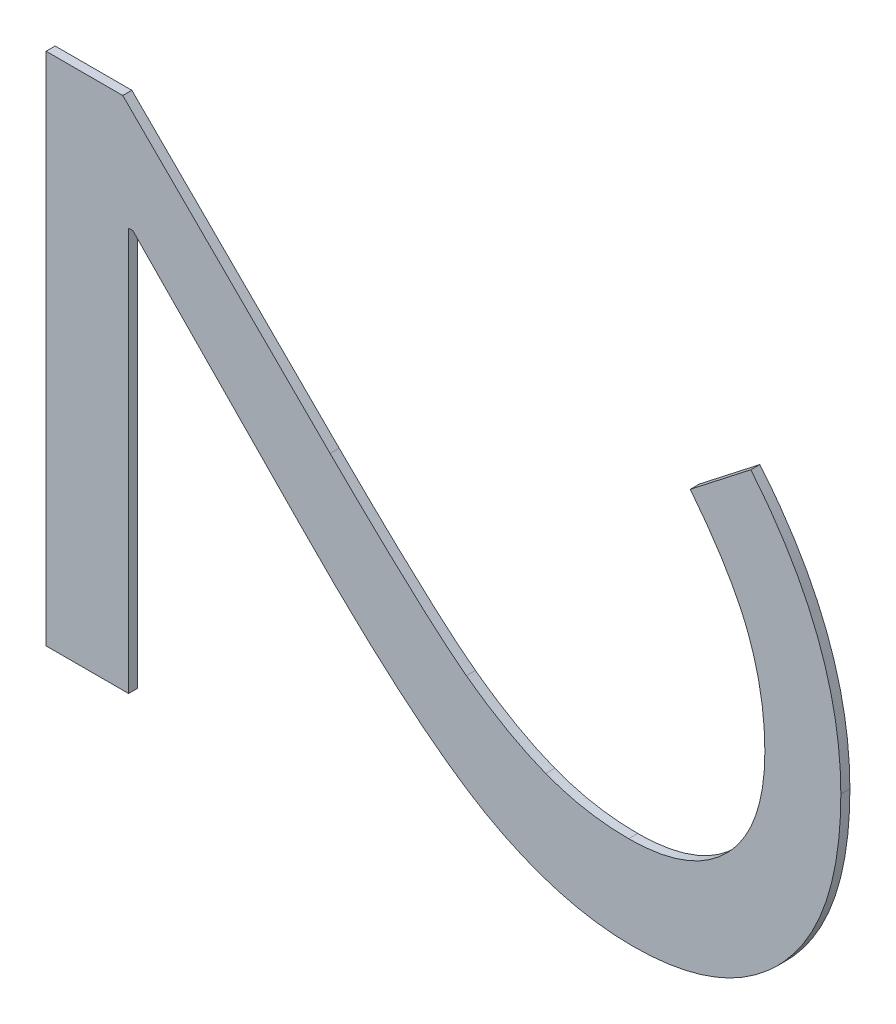
ISO-10303-21;
HEADER;
FILE_DESCRIPTION(('STEP AP214'),'2;1');
FILE_NAME('part.step','',(''),(''),'','','');
FILE_SCHEMA(('AUTOMOTIVE_DESIGN { 1 0 10303 214 1 1 1 1 }'));
ENDSEC;
DATA;
#1=APPLICATION_CONTEXT('core data for automotive mechanical design processes');
#2=APPLICATION_PROTOCOL_DEFINITION('international standard','automotive_design',2000,#1);
#3=PRODUCT_CONTEXT('',#1,'mechanical');
#4=PRODUCT('Part','Part','',(#3));
#5=PRODUCT_RELATED_PRODUCT_CATEGORY('part','',(#4));
#6=PRODUCT_DEFINITION_FORMATION('','',#4);
#7=PRODUCT_DEFINITION_CONTEXT('part definition',#1,'design');
#8=PRODUCT_DEFINITION('design','',#6,#7);
#9=PRODUCT_DEFINITION_SHAPE('','',#8);
#10=(LENGTH_UNIT() NAMED_UNIT(*) SI_UNIT(.MILLI.,.METRE.));
#11=(NAMED_UNIT(*) PLANE_ANGLE_UNIT() SI_UNIT($,.RADIAN.));
#12=(NAMED_UNIT(*) SI_UNIT($,.STERADIAN.) SOLID_ANGLE_UNIT());
#13=UNCERTAINTY_MEASURE_WITH_UNIT(LENGTH_MEASURE(1.E-05),#10,'distance_accuracy_value','');
#14=(GEOMETRIC_REPRESENTATION_CONTEXT(3) GLOBAL_UNCERTAINTY_ASSIGNED_CONTEXT((#13)) GLOBAL_UNIT_ASSIGNED_CONTEXT((#10,
#11,#12)) REPRESENTATION_CONTEXT('',''));
#15=CARTESIAN_POINT('',(0.,0.,0.));
#16=DIRECTION('',(0.,0.,1.));
#17=DIRECTION('',(1.,0.,0.));
#18=AXIS2_PLACEMENT_3D('',#15,#16,#17);
#19=CARTESIAN_POINT('',(32.574920494297,13.734089114766,2.65));
#20=DIRECTION('',(0.,0.,1.));
#21=DIRECTION('',(1.,0.,0.));
#22=AXIS2_PLACEMENT_3D('',#19,#20,#21);
#23=PLANE('',#22);
#24=DIRECTION('',(0.708863560070966,-0.705345626769966,0.));
#25=VECTOR('',#24,1.);
#26=CARTESIAN_POINT('',(33.807483447109,15.013040133365,2.65));
#27=LINE('',#26,#25);
#28=CARTESIAN_POINT('',(33.921845873336,14.8992452626031,2.65));
#29=VERTEX_POINT('',#28);
#30=CARTESIAN_POINT('',(33.693121020883,15.126835004126,2.65));
#31=VERTEX_POINT('',#30);
#32=EDGE_CURVE('E316',#29,#31,#27,.F.);
#33=ORIENTED_EDGE('',*,*,#32,.T.);
#34=DIRECTION('',(1.,0.,0.));
#35=VECTOR('',#34,1.);
#36=CARTESIAN_POINT('',(33.65083813873,15.126835004126,2.65));
#37=LINE('',#36,#35);
#38=CARTESIAN_POINT('',(33.608555256577,15.126835004126,2.65));
#39=VERTEX_POINT('',#38);
#40=EDGE_CURVE('E323',#31,#39,#37,.F.);
#41=ORIENTED_EDGE('',*,*,#40,.T.);
#42=DIRECTION('',(0.,1.,0.));
#43=VECTOR('',#42,1.);
#44=CARTESIAN_POINT('',(33.608555256577,14.842773493822,2.65));
#45=LINE('',#44,#43);
#46=CARTESIAN_POINT('',(33.608555256577,14.558711983517,2.65));
#47=VERTEX_POINT('',#46);
#48=EDGE_CURVE('E313',#39,#47,#45,.F.);
#49=ORIENTED_EDGE('',*,*,#48,.T.);
#50=DIRECTION('',(1.,0.,0.));
#51=VECTOR('',#50,1.);
#52=CARTESIAN_POINT('',(33.654054286366,14.558711983517,2.65));
#53=LINE('',#52,#51);
#54=CARTESIAN_POINT('',(33.699553316155,14.558711983517,2.65));
#55=VERTEX_POINT('',#54);
#56=EDGE_CURVE('E543',#47,#55,#53,.T.);
#57=ORIENTED_EDGE('',*,*,#56,.T.);
#58=DIRECTION('',(0.,1.,0.));
#59=VECTOR('',#58,1.);
#60=CARTESIAN_POINT('',(33.699553316155,14.781004540698,2.65));
#61=LINE('',#60,#59);
#62=CARTESIAN_POINT('',(33.699553316155,15.00329709788,2.65));
#63=VERTEX_POINT('',#62);
#64=EDGE_CURVE('E572',#55,#63,#61,.T.);
#65=ORIENTED_EDGE('',*,*,#64,.T.);
#66=DIRECTION('',(1.,0.,0.));
#67=VECTOR('',#66,1.);
#68=CARTESIAN_POINT('',(33.701918130593,15.00329709788,2.65));
#69=LINE('',#68,#67);
#70=CARTESIAN_POINT('',(33.7042829450308,15.0032970978798,2.65));
#71=VERTEX_POINT('',#70);
#72=EDGE_CURVE('E568',#63,#71,#69,.T.);
#73=ORIENTED_EDGE('',*,*,#72,.T.);
#74=DIRECTION('',(-0.699198848635592,0.714927248093583,0.));
#75=VECTOR('',#74,1.);
#76=CARTESIAN_POINT('',(33.796794485849,14.908704520356,2.65));
#77=LINE('',#76,#75);
#78=CARTESIAN_POINT('',(33.8893060266679,14.8141119428319,2.65));
#79=VERTEX_POINT('',#78);
#80=EDGE_CURVE('E152',#71,#79,#77,.F.);
#81=ORIENTED_EDGE('',*,*,#80,.T.);
#82=CARTESIAN_POINT('',(33.889306026668,14.814111942832,2.65));
#83=CARTESIAN_POINT('',(34.012276377449,14.68773625926,2.65));
#84=CARTESIAN_POINT('',(34.092680068344,14.641575081428,2.65));
#85=B_SPLINE_CURVE_WITH_KNOTS('',2,(#82,#83,#84),.UNSPECIFIED.,.F.,.F.,(3,3),(0.,1.),.UNSPECIFIED.);
#86=CARTESIAN_POINT('',(34.092680068344,14.641575081428,2.65));
#87=VERTEX_POINT('',#86);
#88=EDGE_CURVE('E154',#79,#87,#85,.T.);
#89=ORIENTED_EDGE('',*,*,#88,.T.);
#90=CARTESIAN_POINT('',(34.092680068344,14.641575081428,2.65));
#91=CARTESIAN_POINT('',(34.17308375924,14.595413903596,2.65));
#92=CARTESIAN_POINT('',(34.255379301685,14.595413903596,2.65));
#93=B_SPLINE_CURVE_WITH_KNOTS('',2,(#90,#91,#92),.UNSPECIFIED.,.F.,.F.,(3,3),(0.,1.),.UNSPECIFIED.);
#94=CARTESIAN_POINT('',(34.255379301685,14.595413903596,2.65));
#95=VERTEX_POINT('',#94);
#96=EDGE_CURVE('E156',#87,#95,#93,.T.);
#97=ORIENTED_EDGE('',*,*,#96,.T.);
#98=CARTESIAN_POINT('',(34.255379301685,14.595413903596,2.65));
#99=CARTESIAN_POINT('',(34.360566247892,14.595413903596,2.65));
#100=CARTESIAN_POINT('',(34.42290275648,14.664561077766,2.65));
#101=B_SPLINE_CURVE_WITH_KNOTS('',2,(#98,#99,#100),.UNSPECIFIED.,.F.,.F.,(3,3),(0.,1.),.UNSPECIFIED.);
#102=CARTESIAN_POINT('',(34.42290275648,14.664561077766,2.65));
#103=VERTEX_POINT('',#102);
#104=EDGE_CURVE('E457',#95,#103,#101,.T.);
#105=ORIENTED_EDGE('',*,*,#104,.T.);
#106=CARTESIAN_POINT('',(34.42290275648,14.664561077766,2.65));
#107=CARTESIAN_POINT('',(34.485239265069,14.733708251936,2.65));
#108=CARTESIAN_POINT('',(34.485239265069,14.855543491787,2.65));
#109=B_SPLINE_CURVE_WITH_KNOTS('',2,(#106,#107,#108),.UNSPECIFIED.,.F.,.F.,(3,3),(0.,1.),.UNSPECIFIED.);
#110=CARTESIAN_POINT('',(34.485239265069,14.855543491787,2.65));
#111=VERTEX_POINT('',#110);
#112=EDGE_CURVE('E446',#103,#111,#109,.T.);
#113=ORIENTED_EDGE('',*,*,#112,.T.);
#114=CARTESIAN_POINT('',(34.485239265069,14.855543491787,2.65));
#115=CARTESIAN_POINT('',(34.485239265069,14.996297247143,2.65));
#116=CARTESIAN_POINT('',(34.385917058668,15.115673079978,2.65));
#117=B_SPLINE_CURVE_WITH_KNOTS('',2,(#114,#115,#116),.UNSPECIFIED.,.F.,.F.,(3,3),(0.,1.),.UNSPECIFIED.);
#118=CARTESIAN_POINT('',(34.385917058668,15.115673079978,2.65));
#119=VERTEX_POINT('',#118);
#120=EDGE_CURVE('E445',#111,#119,#117,.T.);
#121=ORIENTED_EDGE('',*,*,#120,.T.);
#122=DIRECTION('',(0.788870641638834,0.614559281729871,0.));
#123=VECTOR('',#122,1.);
#124=CARTESIAN_POINT('',(34.352525878802,15.089660121159,2.65));
#125=LINE('',#124,#123);
#126=CARTESIAN_POINT('',(34.319134698936,15.06364716234,2.65));
#127=VERTEX_POINT('',#126);
#128=EDGE_CURVE('E486',#119,#127,#125,.F.);
#129=ORIENTED_EDGE('',*,*,#128,.T.);
#130=CARTESIAN_POINT('',(34.319134698936,15.06364716234,2.65));
#131=CARTESIAN_POINT('',(34.365863432233,15.004621393965,2.65));
#132=CARTESIAN_POINT('',(34.383646836808,14.956379179428,2.65));
#133=B_SPLINE_CURVE_WITH_KNOTS('',2,(#130,#131,#132),.UNSPECIFIED.,.F.,.F.,(3,3),(0.,1.),.UNSPECIFIED.);
#134=CARTESIAN_POINT('',(34.383646836808,14.956379179428,2.65));
#135=VERTEX_POINT('',#134);
#136=EDGE_CURVE('E410',#127,#135,#133,.T.);
#137=ORIENTED_EDGE('',*,*,#136,.T.);
#138=CARTESIAN_POINT('',(34.383646836808,14.956379179428,2.65));
#139=CARTESIAN_POINT('',(34.401430241382,14.908136964891,2.65));
#140=CARTESIAN_POINT('',(34.401430241382,14.854408380857,2.65));
#141=B_SPLINE_CURVE_WITH_KNOTS('',2,(#138,#139,#140),.UNSPECIFIED.,.F.,.F.,(3,3),(0.,1.),.UNSPECIFIED.);
#142=CARTESIAN_POINT('',(34.401430241382,14.854408380857,2.65));
#143=VERTEX_POINT('',#142);
#144=EDGE_CURVE('E399',#135,#143,#141,.T.);
#145=ORIENTED_EDGE('',*,*,#144,.T.);
#146=CARTESIAN_POINT('',(34.401430241382,14.854408380857,2.65));
#147=CARTESIAN_POINT('',(34.401430241382,14.779869429768,2.65));
#148=CARTESIAN_POINT('',(34.360944618202,14.737870325347,2.65));
#149=B_SPLINE_CURVE_WITH_KNOTS('',2,(#146,#147,#148),.UNSPECIFIED.,.F.,.F.,(3,3),(0.,1.),.UNSPECIFIED.);
#150=CARTESIAN_POINT('',(34.360944618202,14.737870325347,2.65));
#151=VERTEX_POINT('',#150);
#152=EDGE_CURVE('E398',#143,#151,#149,.T.);
#153=ORIENTED_EDGE('',*,*,#152,.T.);
#154=CARTESIAN_POINT('',(34.360944618202,14.737870325347,2.65));
#155=CARTESIAN_POINT('',(34.320458995022,14.695871220927,2.65));
#156=CARTESIAN_POINT('',(34.251217228274,14.695871220927,2.65));
#157=B_SPLINE_CURVE_WITH_KNOTS('',2,(#154,#155,#156),.UNSPECIFIED.,.F.,.F.,(3,3),(0.,1.),.UNSPECIFIED.);
#158=CARTESIAN_POINT('',(34.251217228274,14.695871220927,2.65));
#159=VERTEX_POINT('',#158);
#160=EDGE_CURVE('E368',#151,#159,#157,.T.);
#161=ORIENTED_EDGE('',*,*,#160,.T.);
#162=CARTESIAN_POINT('',(34.251217228274,14.695871220927,2.65));
#163=CARTESIAN_POINT('',(34.202218273117,14.695871220927,2.65));
#164=CARTESIAN_POINT('',(34.159651613231,14.712424921993,2.65));
#165=B_SPLINE_CURVE_WITH_KNOTS('',2,(#162,#163,#164),.UNSPECIFIED.,.F.,.F.,(3,3),(0.,1.),.UNSPECIFIED.);
#166=CARTESIAN_POINT('',(34.159651613231,14.712424921993,2.65));
#167=VERTEX_POINT('',#166);
#168=EDGE_CURVE('E357',#159,#167,#165,.T.);
#169=ORIENTED_EDGE('',*,*,#168,.T.);
#170=CARTESIAN_POINT('',(34.159651613231,14.712424921993,2.65));
#171=CARTESIAN_POINT('',(34.117084953345,14.72897862306,2.65));
#172=CARTESIAN_POINT('',(34.072153479021,14.762086025194,2.65));
#173=B_SPLINE_CURVE_WITH_KNOTS('',2,(#170,#171,#172),.UNSPECIFIED.,.F.,.F.,(3,3),(0.,1.),.UNSPECIFIED.);
#174=CARTESIAN_POINT('',(34.072153479021,14.762086025194,2.65));
#175=VERTEX_POINT('',#174);
#176=EDGE_CURVE('E356',#167,#175,#173,.T.);
#177=ORIENTED_EDGE('',*,*,#176,.T.);
#178=CARTESIAN_POINT('',(34.072153479021,14.762086025194,2.65));
#179=CARTESIAN_POINT('',(34.027222004698,14.795193427327,2.65));
#180=CARTESIAN_POINT('',(33.921845873336,14.899245262603,2.65));
#181=B_SPLINE_CURVE_WITH_KNOTS('',2,(#178,#179,#180),.UNSPECIFIED.,.F.,.F.,(3,3),(0.,1.),.UNSPECIFIED.);
#182=EDGE_CURVE('E317',#175,#29,#181,.T.);
#183=ORIENTED_EDGE('',*,*,#182,.T.);
#184=EDGE_LOOP('',(#33,#41,#49,#57,#65,#73,#81,#89,#97,#105,#113,#121,#129,#137,#145,#153,#161,
#169,#177,#183));
#185=FACE_BOUND('',#184,.T.);
#186=ADVANCED_FACE('F17',(#185),#23,.T.);
#187=CARTESIAN_POINT('',(33.654054286366,14.558711983517,2.64));
#188=DIRECTION('',(0.,1.,0.));
#189=DIRECTION('',(0.,0.,1.));
#190=AXIS2_PLACEMENT_3D('',#187,#188,#189);
#191=PLANE('',#190);
#192=DIRECTION('',(0.,0.,-1.));
#193=VECTOR('',#192,1.);
#194=CARTESIAN_POINT('',(33.608555256577,14.558711983517,2.64));
#195=LINE('',#194,#193);
#196=CARTESIAN_POINT('',(33.608555256577,14.558711983517,2.64));
#197=VERTEX_POINT('',#196);
#198=EDGE_CURVE('E314',#47,#197,#195,.T.);
#199=ORIENTED_EDGE('',*,*,#198,.T.);
#200=DIRECTION('',(1.,0.,0.));
#201=VECTOR('',#200,1.);
#202=CARTESIAN_POINT('',(32.574920494297,14.558711983517,2.64));
#203=LINE('',#202,#201);
#204=CARTESIAN_POINT('',(33.699553316155,14.558711983517,2.64));
#205=VERTEX_POINT('',#204);
#206=EDGE_CURVE('E555',#197,#205,#203,.T.);
#207=ORIENTED_EDGE('',*,*,#206,.T.);
#208=DIRECTION('',(0.,0.,1.));
#209=VECTOR('',#208,1.);
#210=CARTESIAN_POINT('',(33.699553316155,14.558711983517,2.64));
#211=LINE('',#210,#209);
#212=EDGE_CURVE('E550',#205,#55,#211,.T.);
#213=ORIENTED_EDGE('',*,*,#212,.T.);
#214=ORIENTED_EDGE('',*,*,#56,.F.);
#215=EDGE_LOOP('',(#199,#207,#213,#214));
#216=FACE_BOUND('',#215,.T.);
#217=ADVANCED_FACE('F205',(#216),#191,.F.);
#218=CARTESIAN_POINT('',(33.699553316155,14.781004540698,2.64));
#219=DIRECTION('',(-1.,0.,0.));
#220=DIRECTION('',(0.,0.,1.));
#221=AXIS2_PLACEMENT_3D('',#218,#219,#220);
#222=PLANE('',#221);
#223=ORIENTED_EDGE('',*,*,#212,.F.);
#224=DIRECTION('',(0.,1.,0.));
#225=VECTOR('',#224,1.);
#226=CARTESIAN_POINT('',(33.699553316155,13.734089114766,2.64));
#227=LINE('',#226,#225);
#228=CARTESIAN_POINT('',(33.699553316155,15.00329709788,2.64));
#229=VERTEX_POINT('',#228);
#230=EDGE_CURVE('E587',#205,#229,#227,.T.);
#231=ORIENTED_EDGE('',*,*,#230,.T.);
#232=DIRECTION('',(0.,0.,1.));
#233=VECTOR('',#232,1.);
#234=CARTESIAN_POINT('',(33.699553316155,15.00329709788,2.64));
#235=LINE('',#234,#233);
#236=EDGE_CURVE('E570',#229,#63,#235,.T.);
#237=ORIENTED_EDGE('',*,*,#236,.T.);
#238=ORIENTED_EDGE('',*,*,#64,.F.);
#239=EDGE_LOOP('',(#223,#231,#237,#238));
#240=FACE_BOUND('',#239,.T.);
#241=ADVANCED_FACE('F202',(#240),#222,.F.);
#242=CARTESIAN_POINT('',(33.701918130593,15.00329709788,2.64));
#243=DIRECTION('',(0.,1.,0.));
#244=DIRECTION('',(0.,0.,1.));
#245=AXIS2_PLACEMENT_3D('',#242,#243,#244);
#246=PLANE('',#245);
#247=ORIENTED_EDGE('',*,*,#236,.F.);
#248=DIRECTION('',(1.,0.,0.));
#249=VECTOR('',#248,1.);
#250=CARTESIAN_POINT('',(32.574920494297,15.00329709788,2.64));
#251=LINE('',#250,#249);
#252=CARTESIAN_POINT('',(33.7042829450309,15.0032970978799,2.64));
#253=VERTEX_POINT('',#252);
#254=EDGE_CURVE('E309',#229,#253,#251,.T.);
#255=ORIENTED_EDGE('',*,*,#254,.T.);
#256=DIRECTION('',(0.,0.,1.));
#257=VECTOR('',#256,1.);
#258=CARTESIAN_POINT('',(33.7042829450307,15.0032970978798,2.64));
#259=LINE('',#258,#257);
#260=EDGE_CURVE('E565',#253,#71,#259,.T.);
#261=ORIENTED_EDGE('',*,*,#260,.T.);
#262=ORIENTED_EDGE('',*,*,#72,.F.);
#263=EDGE_LOOP('',(#247,#255,#261,#262));
#264=FACE_BOUND('',#263,.T.);
#265=ADVANCED_FACE('F198',(#264),#246,.F.);
#266=CARTESIAN_POINT('',(33.796794485849,14.908704520356,2.64));
#267=DIRECTION('',(0.714927248093583,0.699198848635592,0.));
#268=DIRECTION('',(-0.699198848635592,0.714927248093583,0.));
#269=AXIS2_PLACEMENT_3D('',#266,#267,#268);
#270=PLANE('',#269);
#271=ORIENTED_EDGE('',*,*,#260,.F.);
#272=DIRECTION('',(0.699198848635666,-0.71492724809351,0.));
#273=VECTOR('',#272,1.);
#274=CARTESIAN_POINT('',(33.704282945031,15.00329709788,2.64));
#275=LINE('',#274,#273);
#276=CARTESIAN_POINT('',(33.889306026668,14.814111942832,2.64));
#277=VERTEX_POINT('',#276);
#278=EDGE_CURVE('E306',#253,#277,#275,.T.);
#279=ORIENTED_EDGE('',*,*,#278,.T.);
#280=DIRECTION('',(0.,0.,1.));
#281=VECTOR('',#280,1.);
#282=CARTESIAN_POINT('',(33.889306026668,14.814111942832,2.64));
#283=LINE('',#282,#281);
#284=EDGE_CURVE('E162',#277,#79,#283,.T.);
#285=ORIENTED_EDGE('',*,*,#284,.T.);
#286=ORIENTED_EDGE('',*,*,#80,.F.);
#287=EDGE_LOOP('',(#271,#279,#285,#286));
#288=FACE_BOUND('',#287,.T.);
#289=ADVANCED_FACE('F194',(#288),#270,.F.);
#290=CARTESIAN_POINT('',(34.092680068344,14.641575081428,2.64));
#291=CARTESIAN_POINT('',(34.012276377449,14.68773625926,2.64));
#292=CARTESIAN_POINT('',(33.889306026668,14.814111942832,2.64));
#293=(BOUNDED_CURVE() B_SPLINE_CURVE(2,(#290,#291,#292),.UNSPECIFIED.,.F.,
.F.) B_SPLINE_CURVE_WITH_KNOTS((3,3),(0.,1.),
.UNSPECIFIED.) CURVE() GEOMETRIC_REPRESENTATION_ITEM() RATIONAL_B_SPLINE_CURVE((1.,1.,1.)) REPRESENTATION_ITEM(''));
#294=DIRECTION('',(0.,0.,1.));
#295=VECTOR('',#294,1.);
#296=SURFACE_OF_LINEAR_EXTRUSION('',#293,#295);
#297=ORIENTED_EDGE('',*,*,#284,.F.);
#298=CARTESIAN_POINT('',(33.889306026668,14.814111942832,2.64));
#299=CARTESIAN_POINT('',(34.012276377449,14.68773625926,2.64));
#300=CARTESIAN_POINT('',(34.092680068344,14.641575081428,2.64));
#301=B_SPLINE_CURVE_WITH_KNOTS('',2,(#298,#299,#300),.UNSPECIFIED.,.F.,.F.,(3,3),(0.,1.),.UNSPECIFIED.);
#302=CARTESIAN_POINT('',(34.092680068344,14.641575081428,2.64));
#303=VERTEX_POINT('',#302);
#304=EDGE_CURVE('E174',#277,#303,#301,.T.);
#305=ORIENTED_EDGE('',*,*,#304,.T.);
#306=DIRECTION('',(0.,0.,1.));
#307=VECTOR('',#306,1.);
#308=CARTESIAN_POINT('',(34.092680068344,14.641575081428,2.64));
#309=LINE('',#308,#307);
#310=EDGE_CURVE('E161',#303,#87,#309,.T.);
#311=ORIENTED_EDGE('',*,*,#310,.T.);
#312=ORIENTED_EDGE('',*,*,#88,.F.);
#313=EDGE_LOOP('',(#297,#305,#311,#312));
#314=FACE_BOUND('',#313,.T.);
#315=ADVANCED_FACE('F172',(#314),#296,.F.);
#316=CARTESIAN_POINT('',(34.255379301685,14.595413903596,2.64));
#317=CARTESIAN_POINT('',(34.17308375924,14.595413903596,2.64));
#318=CARTESIAN_POINT('',(34.092680068344,14.641575081428,2.64));
#319=(BOUNDED_CURVE() B_SPLINE_CURVE(2,(#316,#317,#318),.UNSPECIFIED.,.F.,
.F.) B_SPLINE_CURVE_WITH_KNOTS((3,3),(0.,1.),
.UNSPECIFIED.) CURVE() GEOMETRIC_REPRESENTATION_ITEM() RATIONAL_B_SPLINE_CURVE((1.,1.,1.)) REPRESENTATION_ITEM(''));
#320=DIRECTION('',(0.,0.,1.));
#321=VECTOR('',#320,1.);
#322=SURFACE_OF_LINEAR_EXTRUSION('',#319,#321);
#323=ORIENTED_EDGE('',*,*,#310,.F.);
#324=CARTESIAN_POINT('',(34.092680068344,14.641575081428,2.64));
#325=CARTESIAN_POINT('',(34.17308375924,14.595413903596,2.64));
#326=CARTESIAN_POINT('',(34.255379301685,14.595413903596,2.64));
#327=B_SPLINE_CURVE_WITH_KNOTS('',2,(#324,#325,#326),.UNSPECIFIED.,.F.,.F.,(3,3),(0.,1.),.UNSPECIFIED.);
#328=CARTESIAN_POINT('',(34.255379301685,14.595413903596,2.64));
#329=VERTEX_POINT('',#328);
#330=EDGE_CURVE('E240',#303,#329,#327,.T.);
#331=ORIENTED_EDGE('',*,*,#330,.T.);
#332=DIRECTION('',(0.,0.,1.));
#333=VECTOR('',#332,1.);
#334=CARTESIAN_POINT('',(34.255379301685,14.595413903596,2.64));
#335=LINE('',#334,#333);
#336=EDGE_CURVE('E169',#329,#95,#335,.T.);
#337=ORIENTED_EDGE('',*,*,#336,.T.);
#338=ORIENTED_EDGE('',*,*,#96,.F.);
#339=EDGE_LOOP('',(#323,#331,#337,#338));
#340=FACE_BOUND('',#339,.T.);
#341=ADVANCED_FACE('F166',(#340),#322,.F.);
#342=CARTESIAN_POINT('',(34.42290275648,14.664561077766,2.64));
#343=CARTESIAN_POINT('',(34.360566247892,14.595413903596,2.64));
#344=CARTESIAN_POINT('',(34.255379301685,14.595413903596,2.64));
#345=(BOUNDED_CURVE() B_SPLINE_CURVE(2,(#342,#343,#344),.UNSPECIFIED.,.F.,
.F.) B_SPLINE_CURVE_WITH_KNOTS((3,3),(0.,1.),
.UNSPECIFIED.) CURVE() GEOMETRIC_REPRESENTATION_ITEM() RATIONAL_B_SPLINE_CURVE((1.,1.,1.)) REPRESENTATION_ITEM(''));
#346=DIRECTION('',(0.,0.,1.));
#347=VECTOR('',#346,1.);
#348=SURFACE_OF_LINEAR_EXTRUSION('',#345,#347);
#349=ORIENTED_EDGE('',*,*,#336,.F.);
#350=CARTESIAN_POINT('',(34.255379301685,14.595413903596,2.64));
#351=CARTESIAN_POINT('',(34.360566247892,14.595413903596,2.64));
#352=CARTESIAN_POINT('',(34.42290275648,14.664561077766,2.64));
#353=B_SPLINE_CURVE_WITH_KNOTS('',2,(#350,#351,#352),.UNSPECIFIED.,.F.,.F.,(3,3),(0.,1.),.UNSPECIFIED.);
#354=CARTESIAN_POINT('',(34.42290275648,14.664561077766,2.64));
#355=VERTEX_POINT('',#354);
#356=EDGE_CURVE('E244',#329,#355,#353,.T.);
#357=ORIENTED_EDGE('',*,*,#356,.T.);
#358=DIRECTION('',(0.,0.,1.));
#359=VECTOR('',#358,1.);
#360=CARTESIAN_POINT('',(34.42290275648,14.664561077766,2.64));
#361=LINE('',#360,#359);
#362=EDGE_CURVE('E451',#355,#103,#361,.T.);
#363=ORIENTED_EDGE('',*,*,#362,.T.);
#364=ORIENTED_EDGE('',*,*,#104,.F.);
#365=EDGE_LOOP('',(#349,#357,#363,#364));
#366=FACE_BOUND('',#365,.T.);
#367=ADVANCED_FACE('F464',(#366),#348,.F.);
#368=CARTESIAN_POINT('',(34.485239265069,14.855543491787,2.64));
#369=CARTESIAN_POINT('',(34.485239265069,14.733708251936,2.64));
#370=CARTESIAN_POINT('',(34.42290275648,14.664561077766,2.64));
#371=(BOUNDED_CURVE() B_SPLINE_CURVE(2,(#368,#369,#370),.UNSPECIFIED.,.F.,
.F.) B_SPLINE_CURVE_WITH_KNOTS((3,3),(0.,1.),
.UNSPECIFIED.) CURVE() GEOMETRIC_REPRESENTATION_ITEM() RATIONAL_B_SPLINE_CURVE((1.,1.,1.)) REPRESENTATION_ITEM(''));
#372=DIRECTION('',(0.,0.,1.));
#373=VECTOR('',#372,1.);
#374=SURFACE_OF_LINEAR_EXTRUSION('',#371,#373);
#375=ORIENTED_EDGE('',*,*,#362,.F.);
#376=CARTESIAN_POINT('',(34.42290275648,14.664561077766,2.64));
#377=CARTESIAN_POINT('',(34.485239265069,14.733708251936,2.64));
#378=CARTESIAN_POINT('',(34.485239265069,14.855543491787,2.64));
#379=B_SPLINE_CURVE_WITH_KNOTS('',2,(#376,#377,#378),.UNSPECIFIED.,.F.,.F.,(3,3),(0.,1.),.UNSPECIFIED.);
#380=CARTESIAN_POINT('',(34.485239265069,14.855543491787,2.64));
#381=VERTEX_POINT('',#380);
#382=EDGE_CURVE('E248',#355,#381,#379,.T.);
#383=ORIENTED_EDGE('',*,*,#382,.T.);
#384=DIRECTION('',(0.,0.,1.));
#385=VECTOR('',#384,1.);
#386=CARTESIAN_POINT('',(34.485239265069,14.855543491787,2.64));
#387=LINE('',#386,#385);
#388=EDGE_CURVE('E440',#381,#111,#387,.T.);
#389=ORIENTED_EDGE('',*,*,#388,.T.);
#390=ORIENTED_EDGE('',*,*,#112,.F.);
#391=EDGE_LOOP('',(#375,#383,#389,#390));
#392=FACE_BOUND('',#391,.T.);
#393=ADVANCED_FACE('F432',(#392),#374,.F.);
#394=CARTESIAN_POINT('',(34.385917058668,15.115673079978,2.64));
#395=CARTESIAN_POINT('',(34.485239265069,14.996297247143,2.64));
#396=CARTESIAN_POINT('',(34.485239265069,14.855543491787,2.64));
#397=(BOUNDED_CURVE() B_SPLINE_CURVE(2,(#394,#395,#396),.UNSPECIFIED.,.F.,
.F.) B_SPLINE_CURVE_WITH_KNOTS((3,3),(0.,1.),
.UNSPECIFIED.) CURVE() GEOMETRIC_REPRESENTATION_ITEM() RATIONAL_B_SPLINE_CURVE((1.,1.,1.)) REPRESENTATION_ITEM(''));
#398=DIRECTION('',(0.,0.,1.));
#399=VECTOR('',#398,1.);
#400=SURFACE_OF_LINEAR_EXTRUSION('',#397,#399);
#401=ORIENTED_EDGE('',*,*,#388,.F.);
#402=CARTESIAN_POINT('',(34.485239265069,14.855543491787,2.64));
#403=CARTESIAN_POINT('',(34.485239265069,14.996297247143,2.64));
#404=CARTESIAN_POINT('',(34.385917058668,15.115673079978,2.64));
#405=B_SPLINE_CURVE_WITH_KNOTS('',2,(#402,#403,#404),.UNSPECIFIED.,.F.,.F.,(3,3),(0.,1.),.UNSPECIFIED.);
#406=CARTESIAN_POINT('',(34.385917058668,15.115673079978,2.64));
#407=VERTEX_POINT('',#406);
#408=EDGE_CURVE('E252',#381,#407,#405,.T.);
#409=ORIENTED_EDGE('',*,*,#408,.T.);
#410=DIRECTION('',(0.,0.,1.));
#411=VECTOR('',#410,1.);
#412=CARTESIAN_POINT('',(34.3859170586679,15.1156730799781,2.64));
#413=LINE('',#412,#411);
#414=EDGE_CURVE('E439',#407,#119,#413,.T.);
#415=ORIENTED_EDGE('',*,*,#414,.T.);
#416=ORIENTED_EDGE('',*,*,#120,.F.);
#417=EDGE_LOOP('',(#401,#409,#415,#416));
#418=FACE_BOUND('',#417,.T.);
#419=ADVANCED_FACE('F427',(#418),#400,.F.);
#420=CARTESIAN_POINT('',(34.352525878802,15.089660121159,2.64));
#421=DIRECTION('',(0.614559281729871,-0.788870641638834,0.));
#422=DIRECTION('',(0.788870641638834,0.614559281729871,0.));
#423=AXIS2_PLACEMENT_3D('',#420,#421,#422);
#424=PLANE('',#423);
#425=ORIENTED_EDGE('',*,*,#414,.F.);
#426=DIRECTION('',(-0.788870641640186,-0.614559281728134,0.));
#427=VECTOR('',#426,1.);
#428=CARTESIAN_POINT('',(34.385917058668,15.115673079978,2.64));
#429=LINE('',#428,#427);
#430=CARTESIAN_POINT('',(34.319134698936,15.06364716234,2.64));
#431=VERTEX_POINT('',#430);
#432=EDGE_CURVE('E303',#407,#431,#429,.T.);
#433=ORIENTED_EDGE('',*,*,#432,.T.);
#434=DIRECTION('',(0.,0.,1.));
#435=VECTOR('',#434,1.);
#436=CARTESIAN_POINT('',(34.319134698936,15.06364716234,2.64));
#437=LINE('',#436,#435);
#438=EDGE_CURVE('E415',#431,#127,#437,.T.);
#439=ORIENTED_EDGE('',*,*,#438,.T.);
#440=ORIENTED_EDGE('',*,*,#128,.F.);
#441=EDGE_LOOP('',(#425,#433,#439,#440));
#442=FACE_BOUND('',#441,.T.);
#443=ADVANCED_FACE('F423',(#442),#424,.F.);
#444=CARTESIAN_POINT('',(34.383646836808,14.956379179428,2.64));
#445=CARTESIAN_POINT('',(34.365863432233,15.004621393965,2.64));
#446=CARTESIAN_POINT('',(34.319134698936,15.06364716234,2.64));
#447=(BOUNDED_CURVE() B_SPLINE_CURVE(2,(#444,#445,#446),.UNSPECIFIED.,.F.,
.F.) B_SPLINE_CURVE_WITH_KNOTS((3,3),(0.,1.),
.UNSPECIFIED.) CURVE() GEOMETRIC_REPRESENTATION_ITEM() RATIONAL_B_SPLINE_CURVE((1.,1.,1.)) REPRESENTATION_ITEM(''));
#448=DIRECTION('',(0.,0.,1.));
#449=VECTOR('',#448,1.);
#450=SURFACE_OF_LINEAR_EXTRUSION('',#447,#449);
#451=ORIENTED_EDGE('',*,*,#438,.F.);
#452=CARTESIAN_POINT('',(34.319134698936,15.06364716234,2.64));
#453=CARTESIAN_POINT('',(34.365863432233,15.004621393965,2.64));
#454=CARTESIAN_POINT('',(34.383646836808,14.956379179428,2.64));
#455=B_SPLINE_CURVE_WITH_KNOTS('',2,(#452,#453,#454),.UNSPECIFIED.,.F.,.F.,(3,3),(0.,1.),.UNSPECIFIED.);
#456=CARTESIAN_POINT('',(34.383646836808,14.956379179428,2.64));
#457=VERTEX_POINT('',#456);
#458=EDGE_CURVE('E256',#431,#457,#455,.T.);
#459=ORIENTED_EDGE('',*,*,#458,.T.);
#460=DIRECTION('',(0.,0.,1.));
#461=VECTOR('',#460,1.);
#462=CARTESIAN_POINT('',(34.383646836808,14.956379179428,2.64));
#463=LINE('',#462,#461);
#464=EDGE_CURVE('E404',#457,#135,#463,.T.);
#465=ORIENTED_EDGE('',*,*,#464,.T.);
#466=ORIENTED_EDGE('',*,*,#136,.F.);
#467=EDGE_LOOP('',(#451,#459,#465,#466));
#468=FACE_BOUND('',#467,.T.);
#469=ADVANCED_FACE('F420',(#468),#450,.F.);
#470=CARTESIAN_POINT('',(34.401430241382,14.854408380857,2.64));
#471=CARTESIAN_POINT('',(34.401430241382,14.908136964891,2.64));
#472=CARTESIAN_POINT('',(34.383646836808,14.956379179428,2.64));
#473=(BOUNDED_CURVE() B_SPLINE_CURVE(2,(#470,#471,#472),.UNSPECIFIED.,.F.,
.F.) B_SPLINE_CURVE_WITH_KNOTS((3,3),(0.,1.),
.UNSPECIFIED.) CURVE() GEOMETRIC_REPRESENTATION_ITEM() RATIONAL_B_SPLINE_CURVE((1.,1.,1.)) REPRESENTATION_ITEM(''));
#474=DIRECTION('',(0.,0.,1.));
#475=VECTOR('',#474,1.);
#476=SURFACE_OF_LINEAR_EXTRUSION('',#473,#475);
#477=ORIENTED_EDGE('',*,*,#464,.F.);
#478=CARTESIAN_POINT('',(34.383646836808,14.956379179428,2.64));
#479=CARTESIAN_POINT('',(34.401430241382,14.908136964891,2.64));
#480=CARTESIAN_POINT('',(34.401430241382,14.854408380857,2.64));
#481=B_SPLINE_CURVE_WITH_KNOTS('',2,(#478,#479,#480),.UNSPECIFIED.,.F.,.F.,(3,3),(0.,1.),.UNSPECIFIED.);
#482=CARTESIAN_POINT('',(34.401430241382,14.854408380857,2.64));
#483=VERTEX_POINT('',#482);
#484=EDGE_CURVE('E260',#457,#483,#481,.T.);
#485=ORIENTED_EDGE('',*,*,#484,.T.);
#486=DIRECTION('',(0.,0.,1.));
#487=VECTOR('',#486,1.);
#488=CARTESIAN_POINT('',(34.401430241382,14.854408380857,2.64));
#489=LINE('',#488,#487);
#490=EDGE_CURVE('E393',#483,#143,#489,.T.);
#491=ORIENTED_EDGE('',*,*,#490,.T.);
#492=ORIENTED_EDGE('',*,*,#144,.F.);
#493=EDGE_LOOP('',(#477,#485,#491,#492));
#494=FACE_BOUND('',#493,.T.);
#495=ADVANCED_FACE('F385',(#494),#476,.F.);
#496=CARTESIAN_POINT('',(34.360944618202,14.737870325347,2.64));
#497=CARTESIAN_POINT('',(34.401430241382,14.779869429768,2.64));
#498=CARTESIAN_POINT('',(34.401430241382,14.854408380857,2.64));
#499=(BOUNDED_CURVE() B_SPLINE_CURVE(2,(#496,#497,#498),.UNSPECIFIED.,.F.,
.F.) B_SPLINE_CURVE_WITH_KNOTS((3,3),(0.,1.),
.UNSPECIFIED.) CURVE() GEOMETRIC_REPRESENTATION_ITEM() RATIONAL_B_SPLINE_CURVE((1.,1.,1.)) REPRESENTATION_ITEM(''));
#500=DIRECTION('',(0.,0.,1.));
#501=VECTOR('',#500,1.);
#502=SURFACE_OF_LINEAR_EXTRUSION('',#499,#501);
#503=ORIENTED_EDGE('',*,*,#490,.F.);
#504=CARTESIAN_POINT('',(34.401430241382,14.854408380857,2.64));
#505=CARTESIAN_POINT('',(34.401430241382,14.779869429768,2.64));
#506=CARTESIAN_POINT('',(34.360944618202,14.737870325347,2.64));
#507=B_SPLINE_CURVE_WITH_KNOTS('',2,(#504,#505,#506),.UNSPECIFIED.,.F.,.F.,(3,3),(0.,1.),.UNSPECIFIED.);
#508=CARTESIAN_POINT('',(34.360944618202,14.737870325347,2.64));
#509=VERTEX_POINT('',#508);
#510=EDGE_CURVE('E264',#483,#509,#507,.T.);
#511=ORIENTED_EDGE('',*,*,#510,.T.);
#512=DIRECTION('',(0.,0.,1.));
#513=VECTOR('',#512,1.);
#514=CARTESIAN_POINT('',(34.360944618202,14.737870325347,2.64));
#515=LINE('',#514,#513);
#516=EDGE_CURVE('E373',#509,#151,#515,.T.);
#517=ORIENTED_EDGE('',*,*,#516,.T.);
#518=ORIENTED_EDGE('',*,*,#152,.F.);
#519=EDGE_LOOP('',(#503,#511,#517,#518));
#520=FACE_BOUND('',#519,.T.);
#521=ADVANCED_FACE('F381',(#520),#502,.F.);
#522=CARTESIAN_POINT('',(34.251217228274,14.695871220927,2.64));
#523=CARTESIAN_POINT('',(34.320458995022,14.695871220927,2.64));
#524=CARTESIAN_POINT('',(34.360944618202,14.737870325347,2.64));
#525=(BOUNDED_CURVE() B_SPLINE_CURVE(2,(#522,#523,#524),.UNSPECIFIED.,.F.,
.F.) B_SPLINE_CURVE_WITH_KNOTS((3,3),(0.,1.),
.UNSPECIFIED.) CURVE() GEOMETRIC_REPRESENTATION_ITEM() RATIONAL_B_SPLINE_CURVE((1.,1.,1.)) REPRESENTATION_ITEM(''));
#526=DIRECTION('',(0.,0.,1.));
#527=VECTOR('',#526,1.);
#528=SURFACE_OF_LINEAR_EXTRUSION('',#525,#527);
#529=ORIENTED_EDGE('',*,*,#516,.F.);
#530=CARTESIAN_POINT('',(34.360944618202,14.737870325347,2.64));
#531=CARTESIAN_POINT('',(34.320458995022,14.695871220927,2.64));
#532=CARTESIAN_POINT('',(34.251217228274,14.695871220927,2.64));
#533=B_SPLINE_CURVE_WITH_KNOTS('',2,(#530,#531,#532),.UNSPECIFIED.,.F.,.F.,(3,3),(0.,1.),.UNSPECIFIED.);
#534=CARTESIAN_POINT('',(34.251217228274,14.695871220927,2.64));
#535=VERTEX_POINT('',#534);
#536=EDGE_CURVE('E267',#509,#535,#533,.T.);
#537=ORIENTED_EDGE('',*,*,#536,.T.);
#538=DIRECTION('',(0.,0.,1.));
#539=VECTOR('',#538,1.);
#540=CARTESIAN_POINT('',(34.251217228274,14.695871220927,2.64));
#541=LINE('',#540,#539);
#542=EDGE_CURVE('E362',#535,#159,#541,.T.);
#543=ORIENTED_EDGE('',*,*,#542,.T.);
#544=ORIENTED_EDGE('',*,*,#160,.F.);
#545=EDGE_LOOP('',(#529,#537,#543,#544));
#546=FACE_BOUND('',#545,.T.);
#547=ADVANCED_FACE('F378',(#546),#528,.F.);
#548=CARTESIAN_POINT('',(34.159651613231,14.712424921993,2.64));
#549=CARTESIAN_POINT('',(34.202218273117,14.695871220927,2.64));
#550=CARTESIAN_POINT('',(34.251217228274,14.695871220927,2.64));
#551=(BOUNDED_CURVE() B_SPLINE_CURVE(2,(#548,#549,#550),.UNSPECIFIED.,.F.,
.F.) B_SPLINE_CURVE_WITH_KNOTS((3,3),(0.,1.),
.UNSPECIFIED.) CURVE() GEOMETRIC_REPRESENTATION_ITEM() RATIONAL_B_SPLINE_CURVE((1.,1.,1.)) REPRESENTATION_ITEM(''));
#552=DIRECTION('',(0.,0.,1.));
#553=VECTOR('',#552,1.);
#554=SURFACE_OF_LINEAR_EXTRUSION('',#551,#553);
#555=ORIENTED_EDGE('',*,*,#542,.F.);
#556=CARTESIAN_POINT('',(34.251217228274,14.695871220927,2.64));
#557=CARTESIAN_POINT('',(34.202218273117,14.695871220927,2.64));
#558=CARTESIAN_POINT('',(34.159651613231,14.712424921993,2.64));
#559=B_SPLINE_CURVE_WITH_KNOTS('',2,(#556,#557,#558),.UNSPECIFIED.,.F.,.F.,(3,3),(0.,1.),.UNSPECIFIED.);
#560=CARTESIAN_POINT('',(34.159651613231,14.712424921993,2.64));
#561=VERTEX_POINT('',#560);
#562=EDGE_CURVE('E270',#535,#561,#559,.T.);
#563=ORIENTED_EDGE('',*,*,#562,.T.);
#564=DIRECTION('',(0.,0.,1.));
#565=VECTOR('',#564,1.);
#566=CARTESIAN_POINT('',(34.159651613231,14.712424921993,2.64));
#567=LINE('',#566,#565);
#568=EDGE_CURVE('E351',#561,#167,#567,.T.);
#569=ORIENTED_EDGE('',*,*,#568,.T.);
#570=ORIENTED_EDGE('',*,*,#168,.F.);
#571=EDGE_LOOP('',(#555,#563,#569,#570));
#572=FACE_BOUND('',#571,.T.);
#573=ADVANCED_FACE('F344',(#572),#554,.F.);
#574=CARTESIAN_POINT('',(34.072153479021,14.762086025194,2.64));
#575=CARTESIAN_POINT('',(34.117084953345,14.72897862306,2.64));
#576=CARTESIAN_POINT('',(34.159651613231,14.712424921993,2.64));
#577=(BOUNDED_CURVE() B_SPLINE_CURVE(2,(#574,#575,#576),.UNSPECIFIED.,.F.,
.F.) B_SPLINE_CURVE_WITH_KNOTS((3,3),(0.,1.),
.UNSPECIFIED.) CURVE() GEOMETRIC_REPRESENTATION_ITEM() RATIONAL_B_SPLINE_CURVE((1.,1.,1.)) REPRESENTATION_ITEM(''));
#578=DIRECTION('',(0.,0.,1.));
#579=VECTOR('',#578,1.);
#580=SURFACE_OF_LINEAR_EXTRUSION('',#577,#579);
#581=ORIENTED_EDGE('',*,*,#568,.F.);
#582=CARTESIAN_POINT('',(34.159651613231,14.712424921993,2.64));
#583=CARTESIAN_POINT('',(34.117084953345,14.72897862306,2.64));
#584=CARTESIAN_POINT('',(34.072153479021,14.762086025194,2.64));
#585=B_SPLINE_CURVE_WITH_KNOTS('',2,(#582,#583,#584),.UNSPECIFIED.,.F.,.F.,(3,3),(0.,1.),.UNSPECIFIED.);
#586=CARTESIAN_POINT('',(34.072153479021,14.762086025194,2.64));
#587=VERTEX_POINT('',#586);
#588=EDGE_CURVE('E273',#561,#587,#585,.T.);
#589=ORIENTED_EDGE('',*,*,#588,.T.);
#590=DIRECTION('',(0.,0.,1.));
#591=VECTOR('',#590,1.);
#592=CARTESIAN_POINT('',(34.072153479021,14.762086025194,2.64));
#593=LINE('',#592,#591);
#594=EDGE_CURVE('E330',#587,#175,#593,.T.);
#595=ORIENTED_EDGE('',*,*,#594,.T.);
#596=ORIENTED_EDGE('',*,*,#176,.F.);
#597=EDGE_LOOP('',(#581,#589,#595,#596));
#598=FACE_BOUND('',#597,.T.);
#599=ADVANCED_FACE('F341',(#598),#580,.F.);
#600=CARTESIAN_POINT('',(33.921845873336,14.899245262603,2.64));
#601=CARTESIAN_POINT('',(34.027222004698,14.795193427327,2.64));
#602=CARTESIAN_POINT('',(34.072153479021,14.762086025194,2.64));
#603=(BOUNDED_CURVE() B_SPLINE_CURVE(2,(#600,#601,#602),.UNSPECIFIED.,.F.,
.F.) B_SPLINE_CURVE_WITH_KNOTS((3,3),(0.,1.),
.UNSPECIFIED.) CURVE() GEOMETRIC_REPRESENTATION_ITEM() RATIONAL_B_SPLINE_CURVE((1.,1.,1.)) REPRESENTATION_ITEM(''));
#604=DIRECTION('',(0.,0.,1.));
#605=VECTOR('',#604,1.);
#606=SURFACE_OF_LINEAR_EXTRUSION('',#603,#605);
#607=ORIENTED_EDGE('',*,*,#594,.F.);
#608=CARTESIAN_POINT('',(34.072153479021,14.762086025194,2.64));
#609=CARTESIAN_POINT('',(34.027222004698,14.795193427327,2.64));
#610=CARTESIAN_POINT('',(33.921845873336,14.899245262603,2.64));
#611=B_SPLINE_CURVE_WITH_KNOTS('',2,(#608,#609,#610),.UNSPECIFIED.,.F.,.F.,(3,3),(0.,1.),.UNSPECIFIED.);
#612=CARTESIAN_POINT('',(33.921845873336,14.8992452626031,2.64));
#613=VERTEX_POINT('',#612);
#614=EDGE_CURVE('E230',#587,#613,#611,.T.);
#615=ORIENTED_EDGE('',*,*,#614,.T.);
#616=DIRECTION('',(0.,0.,1.));
#617=VECTOR('',#616,1.);
#618=CARTESIAN_POINT('',(33.9218458733361,14.8992452626031,2.64));
#619=LINE('',#618,#617);
#620=EDGE_CURVE('E315',#613,#29,#619,.T.);
#621=ORIENTED_EDGE('',*,*,#620,.T.);
#622=ORIENTED_EDGE('',*,*,#182,.F.);
#623=EDGE_LOOP('',(#607,#615,#621,#622));
#624=FACE_BOUND('',#623,.T.);
#625=ADVANCED_FACE('F336',(#624),#606,.F.);
#626=CARTESIAN_POINT('',(33.807483447109,15.013040133365,2.64));
#627=DIRECTION('',(-0.705345626769966,-0.708863560070966,0.));
#628=DIRECTION('',(0.708863560070966,-0.705345626769966,0.));
#629=AXIS2_PLACEMENT_3D('',#626,#627,#628);
#630=PLANE('',#629);
#631=ORIENTED_EDGE('',*,*,#620,.F.);
#632=DIRECTION('',(-0.708863560070324,0.705345626770611,0.));
#633=VECTOR('',#632,1.);
#634=CARTESIAN_POINT('',(33.921845873336,14.899245262603,2.64));
#635=LINE('',#634,#633);
#636=CARTESIAN_POINT('',(33.693121020883,15.126835004126,2.64));
#637=VERTEX_POINT('',#636);
#638=EDGE_CURVE('E290',#613,#637,#635,.T.);
#639=ORIENTED_EDGE('',*,*,#638,.T.);
#640=DIRECTION('',(0.,0.,-1.));
#641=VECTOR('',#640,1.);
#642=CARTESIAN_POINT('',(33.693121020883,15.126835004126,2.64));
#643=LINE('',#642,#641);
#644=EDGE_CURVE('E321',#637,#31,#643,.F.);
#645=ORIENTED_EDGE('',*,*,#644,.T.);
#646=ORIENTED_EDGE('',*,*,#32,.F.);
#647=EDGE_LOOP('',(#631,#639,#645,#646));
#648=FACE_BOUND('',#647,.T.);
#649=ADVANCED_FACE('F340',(#648),#630,.F.);
#650=CARTESIAN_POINT('',(33.65083813873,15.126835004126,2.64));
#651=DIRECTION('',(0.,-1.,0.));
#652=DIRECTION('',(0.,0.,-1.));
#653=AXIS2_PLACEMENT_3D('',#650,#651,#652);
#654=PLANE('',#653);
#655=ORIENTED_EDGE('',*,*,#644,.F.);
#656=DIRECTION('',(1.,0.,0.));
#657=VECTOR('',#656,1.);
#658=CARTESIAN_POINT('',(32.574920494297,15.126835004126,2.64));
#659=LINE('',#658,#657);
#660=CARTESIAN_POINT('',(33.608555256577,15.126835004126,2.64));
#661=VERTEX_POINT('',#660);
#662=EDGE_CURVE('E27',#637,#661,#659,.F.);
#663=ORIENTED_EDGE('',*,*,#662,.T.);
#664=DIRECTION('',(0.,0.,-1.));
#665=VECTOR('',#664,1.);
#666=CARTESIAN_POINT('',(33.608555256577,15.126835004126,2.64));
#667=LINE('',#666,#665);
#668=EDGE_CURVE('E35',#661,#39,#667,.F.);
#669=ORIENTED_EDGE('',*,*,#668,.T.);
#670=ORIENTED_EDGE('',*,*,#40,.F.);
#671=EDGE_LOOP('',(#655,#663,#669,#670));
#672=FACE_BOUND('',#671,.T.);
#673=ADVANCED_FACE('F222',(#672),#654,.F.);
#674=CARTESIAN_POINT('',(33.608555256577,14.842773493822,2.64));
#675=DIRECTION('',(1.,0.,0.));
#676=DIRECTION('',(0.,0.,-1.));
#677=AXIS2_PLACEMENT_3D('',#674,#675,#676);
#678=PLANE('',#677);
#679=ORIENTED_EDGE('',*,*,#668,.F.);
#680=DIRECTION('',(0.,1.,0.));
#681=VECTOR('',#680,1.);
#682=CARTESIAN_POINT('',(33.608555256577,13.734089114766,2.64));
#683=LINE('',#682,#681);
#684=EDGE_CURVE('E11',#661,#197,#683,.F.);
#685=ORIENTED_EDGE('',*,*,#684,.T.);
#686=ORIENTED_EDGE('',*,*,#198,.F.);
#687=ORIENTED_EDGE('',*,*,#48,.F.);
#688=EDGE_LOOP('',(#679,#685,#686,#687));
#689=FACE_BOUND('',#688,.T.);
#690=ADVANCED_FACE('F216',(#689),#678,.F.);
#691=CARTESIAN_POINT('',(32.574920494297,13.734089114766,2.64));
#692=DIRECTION('',(0.,0.,1.));
#693=DIRECTION('',(1.,0.,0.));
#694=AXIS2_PLACEMENT_3D('',#691,#692,#693);
#695=PLANE('',#694);
#696=ORIENTED_EDGE('',*,*,#662,.F.);
#697=ORIENTED_EDGE('',*,*,#638,.F.);
#698=ORIENTED_EDGE('',*,*,#614,.F.);
#699=ORIENTED_EDGE('',*,*,#588,.F.);
#700=ORIENTED_EDGE('',*,*,#562,.F.);
#701=ORIENTED_EDGE('',*,*,#536,.F.);
#702=ORIENTED_EDGE('',*,*,#510,.F.);
#703=ORIENTED_EDGE('',*,*,#484,.F.);
#704=ORIENTED_EDGE('',*,*,#458,.F.);
#705=ORIENTED_EDGE('',*,*,#432,.F.);
#706=ORIENTED_EDGE('',*,*,#408,.F.);
#707=ORIENTED_EDGE('',*,*,#382,.F.);
#708=ORIENTED_EDGE('',*,*,#356,.F.);
#709=ORIENTED_EDGE('',*,*,#330,.F.);
#710=ORIENTED_EDGE('',*,*,#304,.F.);
#711=ORIENTED_EDGE('',*,*,#278,.F.);
#712=ORIENTED_EDGE('',*,*,#254,.F.);
#713=ORIENTED_EDGE('',*,*,#230,.F.);
#714=ORIENTED_EDGE('',*,*,#206,.F.);
#715=ORIENTED_EDGE('',*,*,#684,.F.);
#716=EDGE_LOOP('',(#696,#697,#698,#699,#700,#701,#702,#703,#704,#705,#706,#707,#708,#709,#710,
#711,#712,#713,#714,#715));
#717=FACE_BOUND('',#716,.T.);
#718=ADVANCED_FACE('F214',(#717),#695,.F.);
#719=CLOSED_SHELL('',(#186,#217,#241,#265,#289,#315,#341,#367,#393,#419,#443,#469,#495,#521,
#547,#573,#599,#625,#649,#673,#690,#718));
#720=MANIFOLD_SOLID_BREP('B1',#719);
#721=ADVANCED_BREP_SHAPE_REPRESENTATION('',(#18,#720),#14);
#722=SHAPE_DEFINITION_REPRESENTATION(#9,#721);
ENDSEC;
END-ISO-10303-21;
